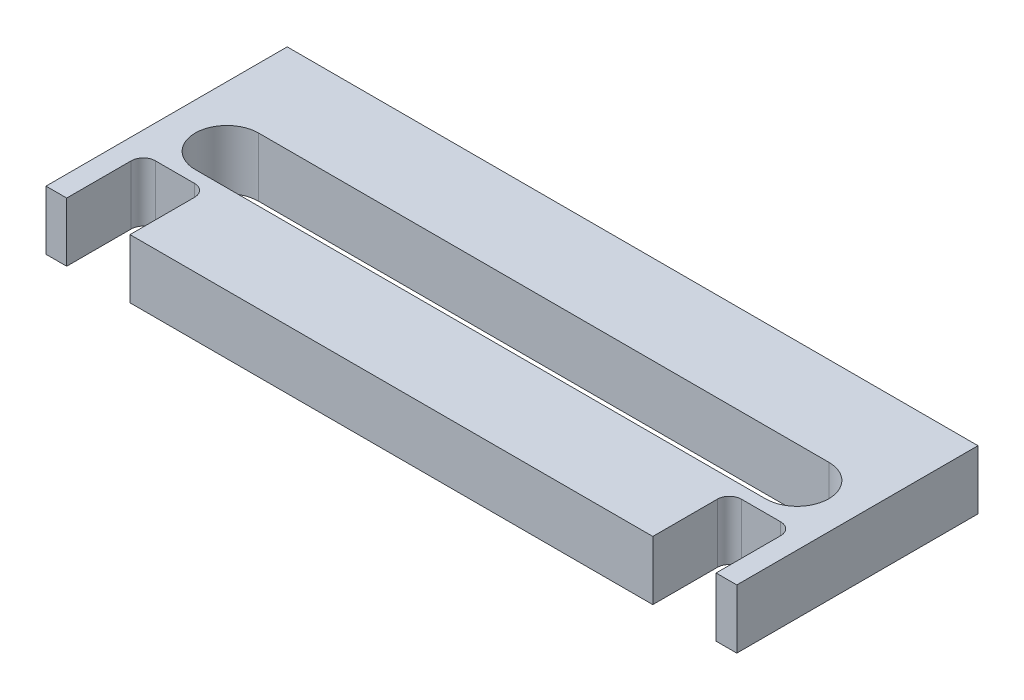
ISO-10303-21;
HEADER;
FILE_DESCRIPTION(('STEP AP214'),'2;1');
FILE_NAME('part.step','',(''),(''),'','','');
FILE_SCHEMA(('AUTOMOTIVE_DESIGN { 1 0 10303 214 1 1 1 1 }'));
ENDSEC;
DATA;
#1=APPLICATION_CONTEXT('core data for automotive mechanical design processes');
#2=APPLICATION_PROTOCOL_DEFINITION('international standard','automotive_design',2000,#1);
#3=PRODUCT_CONTEXT('',#1,'mechanical');
#4=PRODUCT('Part','Part','',(#3));
#5=PRODUCT_RELATED_PRODUCT_CATEGORY('part','',(#4));
#6=PRODUCT_DEFINITION_FORMATION('','',#4);
#7=PRODUCT_DEFINITION_CONTEXT('part definition',#1,'design');
#8=PRODUCT_DEFINITION('design','',#6,#7);
#9=PRODUCT_DEFINITION_SHAPE('','',#8);
#10=(LENGTH_UNIT() NAMED_UNIT(*) SI_UNIT(.MILLI.,.METRE.));
#11=(NAMED_UNIT(*) PLANE_ANGLE_UNIT() SI_UNIT($,.RADIAN.));
#12=(NAMED_UNIT(*) SI_UNIT($,.STERADIAN.) SOLID_ANGLE_UNIT());
#13=UNCERTAINTY_MEASURE_WITH_UNIT(LENGTH_MEASURE(1.E-05),#10,'distance_accuracy_value','');
#14=(GEOMETRIC_REPRESENTATION_CONTEXT(3) GLOBAL_UNCERTAINTY_ASSIGNED_CONTEXT((#13)) GLOBAL_UNIT_ASSIGNED_CONTEXT((#10,
#11,#12)) REPRESENTATION_CONTEXT('',''));
#15=CARTESIAN_POINT('',(0.,0.,0.));
#16=DIRECTION('',(0.,0.,1.));
#17=DIRECTION('',(1.,0.,0.));
#18=AXIS2_PLACEMENT_3D('',#15,#16,#17);
#19=CARTESIAN_POINT('',(1.625,5.1,-26.5));
#20=DIRECTION('',(0.,1.,0.));
#21=DIRECTION('',(0.,0.,1.));
#22=AXIS2_PLACEMENT_3D('',#19,#20,#21);
#23=CYLINDRICAL_SURFACE('',#22,1.);
#24=CARTESIAN_POINT('',(1.625,10.,-26.5));
#25=DIRECTION('',(0.,-1.,0.));
#26=DIRECTION('',(0.,0.,1.));
#27=AXIS2_PLACEMENT_3D('',#24,#25,#26);
#28=CIRCLE('',#27,1.);
#29=CARTESIAN_POINT('',(1.625,10.,-27.5));
#30=VERTEX_POINT('',#29);
#31=CARTESIAN_POINT('',(2.625,10.,-26.5));
#32=VERTEX_POINT('',#31);
#33=EDGE_CURVE('E271',#30,#32,#28,.T.);
#34=ORIENTED_EDGE('',*,*,#33,.F.);
#35=DIRECTION('',(0.,1.,0.));
#36=VECTOR('',#35,1.);
#37=CARTESIAN_POINT('',(1.625,5.1,-27.5));
#38=LINE('',#37,#36);
#39=CARTESIAN_POINT('',(1.625,5.1,-27.5));
#40=VERTEX_POINT('',#39);
#41=EDGE_CURVE('E12',#40,#30,#38,.T.);
#42=ORIENTED_EDGE('',*,*,#41,.F.);
#43=CARTESIAN_POINT('',(1.625,5.1,-26.5));
#44=DIRECTION('',(0.,-1.,0.));
#45=DIRECTION('',(0.,0.,1.));
#46=AXIS2_PLACEMENT_3D('',#43,#44,#45);
#47=CIRCLE('',#46,1.);
#48=CARTESIAN_POINT('',(2.625,5.1,-26.5));
#49=VERTEX_POINT('',#48);
#50=EDGE_CURVE('E304',#40,#49,#47,.T.);
#51=ORIENTED_EDGE('',*,*,#50,.T.);
#52=DIRECTION('',(0.,1.,0.));
#53=VECTOR('',#52,1.);
#54=CARTESIAN_POINT('',(2.625,5.1,-26.5));
#55=LINE('',#54,#53);
#56=EDGE_CURVE('E160',#49,#32,#55,.T.);
#57=ORIENTED_EDGE('',*,*,#56,.T.);
#58=EDGE_LOOP('',(#34,#42,#51,#57));
#59=FACE_BOUND('',#58,.T.);
#60=ADVANCED_FACE('F157',(#59),#23,.F.);
#61=CARTESIAN_POINT('',(-1.625,5.1,-27.5));
#62=DIRECTION('',(0.,0.,1.));
#63=DIRECTION('',(1.,0.,0.));
#64=AXIS2_PLACEMENT_3D('',#61,#62,#63);
#65=PLANE('',#64);
#66=DIRECTION('',(1.,0.,0.));
#67=VECTOR('',#66,1.);
#68=CARTESIAN_POINT('',(-1.625,10.,-27.5));
#69=LINE('',#68,#67);
#70=CARTESIAN_POINT('',(-1.625,10.,-27.5));
#71=VERTEX_POINT('',#70);
#72=EDGE_CURVE('E302',#71,#30,#69,.T.);
#73=ORIENTED_EDGE('',*,*,#72,.F.);
#74=DIRECTION('',(0.,1.,0.));
#75=VECTOR('',#74,1.);
#76=CARTESIAN_POINT('',(-1.625,5.1,-27.5));
#77=LINE('',#76,#75);
#78=CARTESIAN_POINT('',(-1.625,5.1,-27.5));
#79=VERTEX_POINT('',#78);
#80=EDGE_CURVE('E166',#79,#71,#77,.T.);
#81=ORIENTED_EDGE('',*,*,#80,.F.);
#82=DIRECTION('',(1.,0.,0.));
#83=VECTOR('',#82,1.);
#84=CARTESIAN_POINT('',(-1.625,5.1,-27.5));
#85=LINE('',#84,#83);
#86=EDGE_CURVE('E261',#79,#40,#85,.T.);
#87=ORIENTED_EDGE('',*,*,#86,.T.);
#88=ORIENTED_EDGE('',*,*,#41,.T.);
#89=EDGE_LOOP('',(#73,#81,#87,#88));
#90=FACE_BOUND('',#89,.T.);
#91=ADVANCED_FACE('F322',(#90),#65,.T.);
#92=CARTESIAN_POINT('',(-1.625,5.1,-26.5));
#93=DIRECTION('',(0.,1.,0.));
#94=DIRECTION('',(0.,0.,1.));
#95=AXIS2_PLACEMENT_3D('',#92,#93,#94);
#96=CYLINDRICAL_SURFACE('',#95,1.);
#97=CARTESIAN_POINT('',(-1.625,10.,-26.5));
#98=DIRECTION('',(0.,-1.,0.));
#99=DIRECTION('',(0.,0.,1.));
#100=AXIS2_PLACEMENT_3D('',#97,#98,#99);
#101=CIRCLE('',#100,1.);
#102=CARTESIAN_POINT('',(-2.625,10.,-26.5));
#103=VERTEX_POINT('',#102);
#104=EDGE_CURVE('E246',#103,#71,#101,.T.);
#105=ORIENTED_EDGE('',*,*,#104,.F.);
#106=DIRECTION('',(0.,1.,0.));
#107=VECTOR('',#106,1.);
#108=CARTESIAN_POINT('',(-2.625,5.1,-26.5));
#109=LINE('',#108,#107);
#110=CARTESIAN_POINT('',(-2.625,5.1,-26.5));
#111=VERTEX_POINT('',#110);
#112=EDGE_CURVE('E241',#111,#103,#109,.T.);
#113=ORIENTED_EDGE('',*,*,#112,.F.);
#114=CARTESIAN_POINT('',(-1.625,5.1,-26.5));
#115=DIRECTION('',(0.,-1.,0.));
#116=DIRECTION('',(0.,0.,1.));
#117=AXIS2_PLACEMENT_3D('',#114,#115,#116);
#118=CIRCLE('',#117,1.);
#119=EDGE_CURVE('E244',#111,#79,#118,.T.);
#120=ORIENTED_EDGE('',*,*,#119,.T.);
#121=ORIENTED_EDGE('',*,*,#80,.T.);
#122=EDGE_LOOP('',(#105,#113,#120,#121));
#123=FACE_BOUND('',#122,.T.);
#124=ADVANCED_FACE('F243',(#123),#96,.F.);
#125=CARTESIAN_POINT('',(-2.625,5.1,-26.5));
#126=DIRECTION('',(1.,0.,0.));
#127=DIRECTION('',(0.,0.,-1.));
#128=AXIS2_PLACEMENT_3D('',#125,#126,#127);
#129=PLANE('',#128);
#130=DIRECTION('',(0.,0.,-1.));
#131=VECTOR('',#130,1.);
#132=CARTESIAN_POINT('',(-2.625,10.,-26.5));
#133=LINE('',#132,#131);
#134=CARTESIAN_POINT('',(-2.625,10.,-21.1480648995476));
#135=VERTEX_POINT('',#134);
#136=EDGE_CURVE('E299',#135,#103,#133,.T.);
#137=ORIENTED_EDGE('',*,*,#136,.F.);
#138=DIRECTION('',(0.,1.,0.));
#139=VECTOR('',#138,1.);
#140=CARTESIAN_POINT('',(-2.625,5.1,-21.1480648995476));
#141=LINE('',#140,#139);
#142=CARTESIAN_POINT('',(-2.625,5.1,-21.1480648995476));
#143=VERTEX_POINT('',#142);
#144=EDGE_CURVE('E251',#143,#135,#141,.T.);
#145=ORIENTED_EDGE('',*,*,#144,.F.);
#146=DIRECTION('',(0.,0.,-1.));
#147=VECTOR('',#146,1.);
#148=CARTESIAN_POINT('',(-2.625,5.1,-26.5));
#149=LINE('',#148,#147);
#150=EDGE_CURVE('E259',#143,#111,#149,.T.);
#151=ORIENTED_EDGE('',*,*,#150,.T.);
#152=ORIENTED_EDGE('',*,*,#112,.T.);
#153=EDGE_LOOP('',(#137,#145,#151,#152));
#154=FACE_BOUND('',#153,.T.);
#155=ADVANCED_FACE('F263',(#154),#129,.T.);
#156=CARTESIAN_POINT('',(-2.625,5.1,-21.1480648995476));
#157=DIRECTION('',(0.,0.,1.));
#158=DIRECTION('',(1.,0.,0.));
#159=AXIS2_PLACEMENT_3D('',#156,#157,#158);
#160=PLANE('',#159);
#161=DIRECTION('',(1.,0.,0.));
#162=VECTOR('',#161,1.);
#163=CARTESIAN_POINT('',(-2.625,10.,-21.1480648995476));
#164=LINE('',#163,#162);
#165=CARTESIAN_POINT('',(-4.34053483004038,10.,-21.1480648995476));
#166=VERTEX_POINT('',#165);
#167=EDGE_CURVE('E296',#166,#135,#164,.T.);
#168=ORIENTED_EDGE('',*,*,#167,.F.);
#169=DIRECTION('',(0.,1.,0.));
#170=VECTOR('',#169,1.);
#171=CARTESIAN_POINT('',(-4.34053483004038,5.1,-21.1480648995476));
#172=LINE('',#171,#170);
#173=CARTESIAN_POINT('',(-4.34053483004038,5.1,-21.1480648995476));
#174=VERTEX_POINT('',#173);
#175=EDGE_CURVE('E308',#174,#166,#172,.T.);
#176=ORIENTED_EDGE('',*,*,#175,.F.);
#177=DIRECTION('',(1.,0.,0.));
#178=VECTOR('',#177,1.);
#179=CARTESIAN_POINT('',(-2.625,5.1,-21.1480648995476));
#180=LINE('',#179,#178);
#181=EDGE_CURVE('E264',#174,#143,#180,.T.);
#182=ORIENTED_EDGE('',*,*,#181,.T.);
#183=ORIENTED_EDGE('',*,*,#144,.T.);
#184=EDGE_LOOP('',(#168,#176,#182,#183));
#185=FACE_BOUND('',#184,.T.);
#186=ADVANCED_FACE('F335',(#185),#160,.T.);
#187=CARTESIAN_POINT('',(-4.34053483004038,5.1,-21.1480648995476));
#188=DIRECTION('',(-1.,0.,0.));
#189=DIRECTION('',(0.,0.,1.));
#190=AXIS2_PLACEMENT_3D('',#187,#188,#189);
#191=PLANE('',#190);
#192=DIRECTION('',(0.,0.,1.));
#193=VECTOR('',#192,1.);
#194=CARTESIAN_POINT('',(-4.34053483004038,10.,-21.1480648995476));
#195=LINE('',#194,#193);
#196=CARTESIAN_POINT('',(-4.34053483004038,10.,-41.1480648995476));
#197=VERTEX_POINT('',#196);
#198=EDGE_CURVE('E293',#197,#166,#195,.T.);
#199=ORIENTED_EDGE('',*,*,#198,.F.);
#200=DIRECTION('',(0.,1.,0.));
#201=VECTOR('',#200,1.);
#202=CARTESIAN_POINT('',(-4.34053483004038,5.1,-41.1480648995476));
#203=LINE('',#202,#201);
#204=CARTESIAN_POINT('',(-4.34053483004038,5.1,-41.1480648995476));
#205=VERTEX_POINT('',#204);
#206=EDGE_CURVE('E310',#205,#197,#203,.T.);
#207=ORIENTED_EDGE('',*,*,#206,.F.);
#208=DIRECTION('',(0.,0.,1.));
#209=VECTOR('',#208,1.);
#210=CARTESIAN_POINT('',(-4.34053483004038,5.1,-21.1480648995476));
#211=LINE('',#210,#209);
#212=EDGE_CURVE('E266',#205,#174,#211,.T.);
#213=ORIENTED_EDGE('',*,*,#212,.T.);
#214=ORIENTED_EDGE('',*,*,#175,.T.);
#215=EDGE_LOOP('',(#199,#207,#213,#214));
#216=FACE_BOUND('',#215,.T.);
#217=ADVANCED_FACE('F338',(#216),#191,.T.);
#218=CARTESIAN_POINT('',(-4.34053483004038,5.1,-41.1480648995476));
#219=DIRECTION('',(0.,0.,-1.));
#220=DIRECTION('',(-1.,0.,0.));
#221=AXIS2_PLACEMENT_3D('',#218,#219,#220);
#222=PLANE('',#221);
#223=DIRECTION('',(-1.,0.,0.));
#224=VECTOR('',#223,1.);
#225=CARTESIAN_POINT('',(-4.34053483004038,10.,-41.1480648995476));
#226=LINE('',#225,#224);
#227=CARTESIAN_POINT('',(52.9405348300404,10.,-41.1480648995476));
#228=VERTEX_POINT('',#227);
#229=EDGE_CURVE('E290',#228,#197,#226,.T.);
#230=ORIENTED_EDGE('',*,*,#229,.F.);
#231=DIRECTION('',(0.,1.,0.));
#232=VECTOR('',#231,1.);
#233=CARTESIAN_POINT('',(52.9405348300404,5.1,-41.1480648995476));
#234=LINE('',#233,#232);
#235=CARTESIAN_POINT('',(52.9405348300404,5.1,-41.1480648995476));
#236=VERTEX_POINT('',#235);
#237=EDGE_CURVE('E466',#236,#228,#234,.T.);
#238=ORIENTED_EDGE('',*,*,#237,.F.);
#239=DIRECTION('',(-1.,0.,0.));
#240=VECTOR('',#239,1.);
#241=CARTESIAN_POINT('',(-4.34053483004038,5.1,-41.1480648995476));
#242=LINE('',#241,#240);
#243=EDGE_CURVE('E507',#236,#205,#242,.T.);
#244=ORIENTED_EDGE('',*,*,#243,.T.);
#245=ORIENTED_EDGE('',*,*,#206,.T.);
#246=EDGE_LOOP('',(#230,#238,#244,#245));
#247=FACE_BOUND('',#246,.T.);
#248=ADVANCED_FACE('F342',(#247),#222,.T.);
#249=CARTESIAN_POINT('',(0.659465169959616,5.1,-33.7730648995476));
#250=DIRECTION('',(0.,0.,1.));
#251=DIRECTION('',(1.,0.,0.));
#252=AXIS2_PLACEMENT_3D('',#249,#250,#251);
#253=PLANE('',#252);
#254=DIRECTION('',(1.,0.,0.));
#255=VECTOR('',#254,1.);
#256=CARTESIAN_POINT('',(0.659465169959616,10.,-33.7730648995476));
#257=LINE('',#256,#255);
#258=CARTESIAN_POINT('',(0.659465169959616,10.,-33.7730648995476));
#259=VERTEX_POINT('',#258);
#260=CARTESIAN_POINT('',(47.9405348300404,10.,-33.7730648995476));
#261=VERTEX_POINT('',#260);
#262=EDGE_CURVE('E287',#259,#261,#257,.T.);
#263=ORIENTED_EDGE('',*,*,#262,.F.);
#264=DIRECTION('',(0.,1.,0.));
#265=VECTOR('',#264,1.);
#266=CARTESIAN_POINT('',(0.659465169959616,5.1,-33.7730648995476));
#267=LINE('',#266,#265);
#268=CARTESIAN_POINT('',(0.659465169959616,5.1,-33.7730648995476));
#269=VERTEX_POINT('',#268);
#270=EDGE_CURVE('E312',#269,#259,#267,.T.);
#271=ORIENTED_EDGE('',*,*,#270,.F.);
#272=DIRECTION('',(1.,0.,0.));
#273=VECTOR('',#272,1.);
#274=CARTESIAN_POINT('',(0.659465169959616,5.1,-33.7730648995476));
#275=LINE('',#274,#273);
#276=CARTESIAN_POINT('',(47.9405348300404,5.1,-33.7730648995476));
#277=VERTEX_POINT('',#276);
#278=EDGE_CURVE('E504',#269,#277,#275,.T.);
#279=ORIENTED_EDGE('',*,*,#278,.T.);
#280=DIRECTION('',(0.,1.,0.));
#281=VECTOR('',#280,1.);
#282=CARTESIAN_POINT('',(47.9405348300404,5.1,-33.7730648995476));
#283=LINE('',#282,#281);
#284=EDGE_CURVE('E472',#277,#261,#283,.T.);
#285=ORIENTED_EDGE('',*,*,#284,.T.);
#286=EDGE_LOOP('',(#263,#271,#279,#285));
#287=FACE_BOUND('',#286,.T.);
#288=ADVANCED_FACE('F346',(#287),#253,.T.);
#289=CARTESIAN_POINT('',(0.659465169959616,5.1,-31.1480648995476));
#290=DIRECTION('',(0.,1.,0.));
#291=DIRECTION('',(0.,0.,1.));
#292=AXIS2_PLACEMENT_3D('',#289,#290,#291);
#293=CYLINDRICAL_SURFACE('',#292,2.625);
#294=CARTESIAN_POINT('',(0.659465169959616,10.,-31.1480648995476));
#295=DIRECTION('',(0.,-1.,0.));
#296=DIRECTION('',(0.,0.,1.));
#297=AXIS2_PLACEMENT_3D('',#294,#295,#296);
#298=CIRCLE('',#297,2.625);
#299=CARTESIAN_POINT('',(0.659465169959616,10.,-28.5230648995476));
#300=VERTEX_POINT('',#299);
#301=EDGE_CURVE('E284',#300,#259,#298,.T.);
#302=ORIENTED_EDGE('',*,*,#301,.F.);
#303=DIRECTION('',(0.,1.,0.));
#304=VECTOR('',#303,1.);
#305=CARTESIAN_POINT('',(0.659465169959616,5.1,-28.5230648995476));
#306=LINE('',#305,#304);
#307=CARTESIAN_POINT('',(0.659465169959616,5.1,-28.5230648995476));
#308=VERTEX_POINT('',#307);
#309=EDGE_CURVE('E314',#308,#300,#306,.T.);
#310=ORIENTED_EDGE('',*,*,#309,.F.);
#311=CARTESIAN_POINT('',(0.659465169959616,5.1,-31.1480648995476));
#312=DIRECTION('',(0.,-1.,0.));
#313=DIRECTION('',(0.,0.,1.));
#314=AXIS2_PLACEMENT_3D('',#311,#312,#313);
#315=CIRCLE('',#314,2.625);
#316=EDGE_CURVE('E501',#308,#269,#315,.T.);
#317=ORIENTED_EDGE('',*,*,#316,.T.);
#318=ORIENTED_EDGE('',*,*,#270,.T.);
#319=EDGE_LOOP('',(#302,#310,#317,#318));
#320=FACE_BOUND('',#319,.T.);
#321=ADVANCED_FACE('F350',(#320),#293,.F.);
#322=CARTESIAN_POINT('',(0.659465169959616,5.1,-28.5230648995476));
#323=DIRECTION('',(0.,0.,-1.));
#324=DIRECTION('',(-1.,0.,0.));
#325=AXIS2_PLACEMENT_3D('',#322,#323,#324);
#326=PLANE('',#325);
#327=DIRECTION('',(-1.,0.,0.));
#328=VECTOR('',#327,1.);
#329=CARTESIAN_POINT('',(0.659465169959616,10.,-28.5230648995476));
#330=LINE('',#329,#328);
#331=CARTESIAN_POINT('',(47.9405348300404,10.,-28.5230648995476));
#332=VERTEX_POINT('',#331);
#333=EDGE_CURVE('E281',#332,#300,#330,.T.);
#334=ORIENTED_EDGE('',*,*,#333,.F.);
#335=DIRECTION('',(0.,1.,0.));
#336=VECTOR('',#335,1.);
#337=CARTESIAN_POINT('',(47.9405348300404,5.1,-28.5230648995476));
#338=LINE('',#337,#336);
#339=CARTESIAN_POINT('',(47.9405348300404,5.1,-28.5230648995476));
#340=VERTEX_POINT('',#339);
#341=EDGE_CURVE('E478',#340,#332,#338,.T.);
#342=ORIENTED_EDGE('',*,*,#341,.F.);
#343=DIRECTION('',(-1.,0.,0.));
#344=VECTOR('',#343,1.);
#345=CARTESIAN_POINT('',(0.659465169959616,5.1,-28.5230648995476));
#346=LINE('',#345,#344);
#347=EDGE_CURVE('E498',#340,#308,#346,.T.);
#348=ORIENTED_EDGE('',*,*,#347,.T.);
#349=ORIENTED_EDGE('',*,*,#309,.T.);
#350=EDGE_LOOP('',(#334,#342,#348,#349));
#351=FACE_BOUND('',#350,.T.);
#352=ADVANCED_FACE('F354',(#351),#326,.T.);
#353=CARTESIAN_POINT('',(24.3,5.1,-21.1480648995476));
#354=DIRECTION('',(0.,0.,1.));
#355=DIRECTION('',(1.,0.,0.));
#356=AXIS2_PLACEMENT_3D('',#353,#354,#355);
#357=PLANE('',#356);
#358=DIRECTION('',(1.,0.,0.));
#359=VECTOR('',#358,1.);
#360=CARTESIAN_POINT('',(24.3,10.,-21.1480648995476));
#361=LINE('',#360,#359);
#362=CARTESIAN_POINT('',(2.625,10.,-21.1480648995476));
#363=VERTEX_POINT('',#362);
#364=CARTESIAN_POINT('',(45.975,10.,-21.1480648995476));
#365=VERTEX_POINT('',#364);
#366=EDGE_CURVE('E278',#363,#365,#361,.T.);
#367=ORIENTED_EDGE('',*,*,#366,.F.);
#368=DIRECTION('',(0.,1.,0.));
#369=VECTOR('',#368,1.);
#370=CARTESIAN_POINT('',(2.625,5.1,-21.1480648995476));
#371=LINE('',#370,#369);
#372=CARTESIAN_POINT('',(2.625,5.1,-21.1480648995476));
#373=VERTEX_POINT('',#372);
#374=EDGE_CURVE('E315',#373,#363,#371,.T.);
#375=ORIENTED_EDGE('',*,*,#374,.F.);
#376=DIRECTION('',(1.,0.,0.));
#377=VECTOR('',#376,1.);
#378=CARTESIAN_POINT('',(24.3,5.1,-21.1480648995476));
#379=LINE('',#378,#377);
#380=CARTESIAN_POINT('',(45.975,5.1,-21.1480648995476));
#381=VERTEX_POINT('',#380);
#382=EDGE_CURVE('E495',#373,#381,#379,.T.);
#383=ORIENTED_EDGE('',*,*,#382,.T.);
#384=DIRECTION('',(0.,1.,0.));
#385=VECTOR('',#384,1.);
#386=CARTESIAN_POINT('',(45.975,5.1,-21.1480648995476));
#387=LINE('',#386,#385);
#388=EDGE_CURVE('E484',#381,#365,#387,.T.);
#389=ORIENTED_EDGE('',*,*,#388,.T.);
#390=EDGE_LOOP('',(#367,#375,#383,#389));
#391=FACE_BOUND('',#390,.T.);
#392=ADVANCED_FACE('F358',(#391),#357,.T.);
#393=CARTESIAN_POINT('',(2.625,5.1,-21.1480648995476));
#394=DIRECTION('',(-1.,0.,0.));
#395=DIRECTION('',(0.,0.,1.));
#396=AXIS2_PLACEMENT_3D('',#393,#394,#395);
#397=PLANE('',#396);
#398=DIRECTION('',(0.,0.,1.));
#399=VECTOR('',#398,1.);
#400=CARTESIAN_POINT('',(2.625,10.,-21.1480648995476));
#401=LINE('',#400,#399);
#402=EDGE_CURVE('E274',#32,#363,#401,.T.);
#403=ORIENTED_EDGE('',*,*,#402,.F.);
#404=ORIENTED_EDGE('',*,*,#56,.F.);
#405=DIRECTION('',(0.,0.,1.));
#406=VECTOR('',#405,1.);
#407=CARTESIAN_POINT('',(2.625,5.1,-21.1480648995476));
#408=LINE('',#407,#406);
#409=EDGE_CURVE('E493',#49,#373,#408,.T.);
#410=ORIENTED_EDGE('',*,*,#409,.T.);
#411=ORIENTED_EDGE('',*,*,#374,.T.);
#412=EDGE_LOOP('',(#403,#404,#410,#411));
#413=FACE_BOUND('',#412,.T.);
#414=ADVANCED_FACE('F317',(#413),#397,.T.);
#415=CARTESIAN_POINT('',(1.625,5.1,-26.5));
#416=DIRECTION('',(0.,1.,0.));
#417=DIRECTION('',(0.,0.,1.));
#418=AXIS2_PLACEMENT_3D('',#415,#416,#417);
#419=PLANE('',#418);
#420=ORIENTED_EDGE('',*,*,#243,.F.);
#421=DIRECTION('',(0.,0.,1.));
#422=VECTOR('',#421,1.);
#423=CARTESIAN_POINT('',(52.9405348300404,5.1,-21.1480648995476));
#424=LINE('',#423,#422);
#425=CARTESIAN_POINT('',(52.9405348300404,5.1,-21.1480648995476));
#426=VERTEX_POINT('',#425);
#427=EDGE_CURVE('E469',#236,#426,#424,.T.);
#428=ORIENTED_EDGE('',*,*,#427,.T.);
#429=DIRECTION('',(-1.,0.,0.));
#430=VECTOR('',#429,1.);
#431=CARTESIAN_POINT('',(51.225,5.1,-21.1480648995476));
#432=LINE('',#431,#430);
#433=CARTESIAN_POINT('',(51.225,5.1,-21.1480648995476));
#434=VERTEX_POINT('',#433);
#435=EDGE_CURVE('E460',#426,#434,#432,.T.);
#436=ORIENTED_EDGE('',*,*,#435,.T.);
#437=DIRECTION('',(0.,0.,-1.));
#438=VECTOR('',#437,1.);
#439=CARTESIAN_POINT('',(51.225,5.1,-26.5));
#440=LINE('',#439,#438);
#441=CARTESIAN_POINT('',(51.225,5.1,-26.5));
#442=VERTEX_POINT('',#441);
#443=EDGE_CURVE('E451',#434,#442,#440,.T.);
#444=ORIENTED_EDGE('',*,*,#443,.T.);
#445=CARTESIAN_POINT('',(50.225,5.1,-26.5));
#446=DIRECTION('',(0.,1.,0.));
#447=DIRECTION('',(0.,0.,1.));
#448=AXIS2_PLACEMENT_3D('',#445,#446,#447);
#449=CIRCLE('',#448,1.);
#450=CARTESIAN_POINT('',(50.225,5.1,-27.5));
#451=VERTEX_POINT('',#450);
#452=EDGE_CURVE('E442',#442,#451,#449,.T.);
#453=ORIENTED_EDGE('',*,*,#452,.T.);
#454=DIRECTION('',(-1.,0.,0.));
#455=VECTOR('',#454,1.);
#456=CARTESIAN_POINT('',(50.225,5.1,-27.5));
#457=LINE('',#456,#455);
#458=CARTESIAN_POINT('',(46.975,5.1,-27.5));
#459=VERTEX_POINT('',#458);
#460=EDGE_CURVE('E433',#451,#459,#457,.T.);
#461=ORIENTED_EDGE('',*,*,#460,.T.);
#462=CARTESIAN_POINT('',(46.975,5.1,-26.5));
#463=DIRECTION('',(0.,1.,0.));
#464=DIRECTION('',(0.,0.,1.));
#465=AXIS2_PLACEMENT_3D('',#462,#463,#464);
#466=CIRCLE('',#465,1.);
#467=CARTESIAN_POINT('',(45.975,5.1,-26.5));
#468=VERTEX_POINT('',#467);
#469=EDGE_CURVE('E421',#459,#468,#466,.T.);
#470=ORIENTED_EDGE('',*,*,#469,.T.);
#471=DIRECTION('',(0.,0.,1.));
#472=VECTOR('',#471,1.);
#473=CARTESIAN_POINT('',(45.975,5.1,-21.1480648995476));
#474=LINE('',#473,#472);
#475=EDGE_CURVE('E275',#468,#381,#474,.T.);
#476=ORIENTED_EDGE('',*,*,#475,.T.);
#477=ORIENTED_EDGE('',*,*,#382,.F.);
#478=ORIENTED_EDGE('',*,*,#409,.F.);
#479=ORIENTED_EDGE('',*,*,#50,.F.);
#480=ORIENTED_EDGE('',*,*,#86,.F.);
#481=ORIENTED_EDGE('',*,*,#119,.F.);
#482=ORIENTED_EDGE('',*,*,#150,.F.);
#483=ORIENTED_EDGE('',*,*,#181,.F.);
#484=ORIENTED_EDGE('',*,*,#212,.F.);
#485=EDGE_LOOP('',(#420,#428,#436,#444,#453,#461,#470,#476,#477,#478,#479,#480,#481,#482,#483,#484));
#486=FACE_BOUND('',#485,.T.);
#487=CARTESIAN_POINT('',(47.9405348300404,5.1,-31.1480648995476));
#488=DIRECTION('',(0.,1.,0.));
#489=DIRECTION('',(0.,0.,1.));
#490=AXIS2_PLACEMENT_3D('',#487,#488,#489);
#491=CIRCLE('',#490,2.625);
#492=EDGE_CURVE('E481',#340,#277,#491,.T.);
#493=ORIENTED_EDGE('',*,*,#492,.T.);
#494=ORIENTED_EDGE('',*,*,#278,.F.);
#495=ORIENTED_EDGE('',*,*,#316,.F.);
#496=ORIENTED_EDGE('',*,*,#347,.F.);
#497=EDGE_LOOP('',(#493,#494,#495,#496));
#498=FACE_BOUND('',#497,.T.);
#499=ADVANCED_FACE('F256',(#486,#498),#419,.F.);
#500=CARTESIAN_POINT('',(1.625,10.,-26.5));
#501=DIRECTION('',(0.,1.,0.));
#502=DIRECTION('',(0.,0.,1.));
#503=AXIS2_PLACEMENT_3D('',#500,#501,#502);
#504=PLANE('',#503);
#505=DIRECTION('',(0.,0.,1.));
#506=VECTOR('',#505,1.);
#507=CARTESIAN_POINT('',(52.9405348300404,10.,-21.1480648995476));
#508=LINE('',#507,#506);
#509=CARTESIAN_POINT('',(52.9405348300404,10.,-21.1480648995476));
#510=VERTEX_POINT('',#509);
#511=EDGE_CURVE('E463',#228,#510,#508,.T.);
#512=ORIENTED_EDGE('',*,*,#511,.F.);
#513=ORIENTED_EDGE('',*,*,#229,.T.);
#514=ORIENTED_EDGE('',*,*,#198,.T.);
#515=ORIENTED_EDGE('',*,*,#167,.T.);
#516=ORIENTED_EDGE('',*,*,#136,.T.);
#517=ORIENTED_EDGE('',*,*,#104,.T.);
#518=ORIENTED_EDGE('',*,*,#72,.T.);
#519=ORIENTED_EDGE('',*,*,#33,.T.);
#520=ORIENTED_EDGE('',*,*,#402,.T.);
#521=ORIENTED_EDGE('',*,*,#366,.T.);
#522=DIRECTION('',(0.,0.,1.));
#523=VECTOR('',#522,1.);
#524=CARTESIAN_POINT('',(45.975,10.,-21.1480648995476));
#525=LINE('',#524,#523);
#526=CARTESIAN_POINT('',(45.975,10.,-26.5));
#527=VERTEX_POINT('',#526);
#528=EDGE_CURVE('E487',#527,#365,#525,.T.);
#529=ORIENTED_EDGE('',*,*,#528,.F.);
#530=CARTESIAN_POINT('',(46.975,10.,-26.5));
#531=DIRECTION('',(0.,1.,0.));
#532=DIRECTION('',(0.,0.,1.));
#533=AXIS2_PLACEMENT_3D('',#530,#531,#532);
#534=CIRCLE('',#533,1.);
#535=CARTESIAN_POINT('',(46.975,10.,-27.5));
#536=VERTEX_POINT('',#535);
#537=EDGE_CURVE('E408',#536,#527,#534,.T.);
#538=ORIENTED_EDGE('',*,*,#537,.F.);
#539=DIRECTION('',(-1.,0.,0.));
#540=VECTOR('',#539,1.);
#541=CARTESIAN_POINT('',(50.225,10.,-27.5));
#542=LINE('',#541,#540);
#543=CARTESIAN_POINT('',(50.225,10.,-27.5));
#544=VERTEX_POINT('',#543);
#545=EDGE_CURVE('E427',#544,#536,#542,.T.);
#546=ORIENTED_EDGE('',*,*,#545,.F.);
#547=CARTESIAN_POINT('',(50.225,10.,-26.5));
#548=DIRECTION('',(0.,1.,0.));
#549=DIRECTION('',(0.,0.,1.));
#550=AXIS2_PLACEMENT_3D('',#547,#548,#549);
#551=CIRCLE('',#550,1.);
#552=CARTESIAN_POINT('',(51.225,10.,-26.5));
#553=VERTEX_POINT('',#552);
#554=EDGE_CURVE('E436',#553,#544,#551,.T.);
#555=ORIENTED_EDGE('',*,*,#554,.F.);
#556=DIRECTION('',(0.,0.,-1.));
#557=VECTOR('',#556,1.);
#558=CARTESIAN_POINT('',(51.225,10.,-26.5));
#559=LINE('',#558,#557);
#560=CARTESIAN_POINT('',(51.225,10.,-21.1480648995476));
#561=VERTEX_POINT('',#560);
#562=EDGE_CURVE('E445',#561,#553,#559,.T.);
#563=ORIENTED_EDGE('',*,*,#562,.F.);
#564=DIRECTION('',(-1.,0.,0.));
#565=VECTOR('',#564,1.);
#566=CARTESIAN_POINT('',(51.225,10.,-21.1480648995476));
#567=LINE('',#566,#565);
#568=EDGE_CURVE('E454',#510,#561,#567,.T.);
#569=ORIENTED_EDGE('',*,*,#568,.F.);
#570=EDGE_LOOP('',(#512,#513,#514,#515,#516,#517,#518,#519,#520,#521,#529,#538,#546,#555,#563,#569));
#571=FACE_BOUND('',#570,.T.);
#572=ORIENTED_EDGE('',*,*,#262,.T.);
#573=CARTESIAN_POINT('',(47.9405348300404,10.,-31.1480648995476));
#574=DIRECTION('',(0.,1.,0.));
#575=DIRECTION('',(0.,0.,1.));
#576=AXIS2_PLACEMENT_3D('',#573,#574,#575);
#577=CIRCLE('',#576,2.625);
#578=EDGE_CURVE('E475',#332,#261,#577,.T.);
#579=ORIENTED_EDGE('',*,*,#578,.F.);
#580=ORIENTED_EDGE('',*,*,#333,.T.);
#581=ORIENTED_EDGE('',*,*,#301,.T.);
#582=EDGE_LOOP('',(#572,#579,#580,#581));
#583=FACE_BOUND('',#582,.T.);
#584=ADVANCED_FACE('F320',(#571,#583),#504,.T.);
#585=CARTESIAN_POINT('',(46.975,5.1,-26.5));
#586=DIRECTION('',(0.,1.,0.));
#587=DIRECTION('',(0.,0.,1.));
#588=AXIS2_PLACEMENT_3D('',#585,#586,#587);
#589=CYLINDRICAL_SURFACE('',#588,1.);
#590=ORIENTED_EDGE('',*,*,#537,.T.);
#591=DIRECTION('',(0.,1.,0.));
#592=VECTOR('',#591,1.);
#593=CARTESIAN_POINT('',(45.975,5.1,-26.5));
#594=LINE('',#593,#592);
#595=EDGE_CURVE('E412',#468,#527,#594,.T.);
#596=ORIENTED_EDGE('',*,*,#595,.F.);
#597=ORIENTED_EDGE('',*,*,#469,.F.);
#598=DIRECTION('',(0.,1.,0.));
#599=VECTOR('',#598,1.);
#600=CARTESIAN_POINT('',(46.975,5.1,-27.5));
#601=LINE('',#600,#599);
#602=EDGE_CURVE('E415',#459,#536,#601,.T.);
#603=ORIENTED_EDGE('',*,*,#602,.T.);
#604=EDGE_LOOP('',(#590,#596,#597,#603));
#605=FACE_BOUND('',#604,.T.);
#606=ADVANCED_FACE('F369',(#605),#589,.F.);
#607=CARTESIAN_POINT('',(50.225,5.1,-27.5));
#608=DIRECTION('',(0.,0.,1.));
#609=DIRECTION('',(-1.,0.,0.));
#610=AXIS2_PLACEMENT_3D('',#607,#608,#609);
#611=PLANE('',#610);
#612=ORIENTED_EDGE('',*,*,#545,.T.);
#613=ORIENTED_EDGE('',*,*,#602,.F.);
#614=ORIENTED_EDGE('',*,*,#460,.F.);
#615=DIRECTION('',(0.,1.,0.));
#616=VECTOR('',#615,1.);
#617=CARTESIAN_POINT('',(50.225,5.1,-27.5));
#618=LINE('',#617,#616);
#619=EDGE_CURVE('E430',#451,#544,#618,.T.);
#620=ORIENTED_EDGE('',*,*,#619,.T.);
#621=EDGE_LOOP('',(#612,#613,#614,#620));
#622=FACE_BOUND('',#621,.T.);
#623=ADVANCED_FACE('F394',(#622),#611,.T.);
#624=CARTESIAN_POINT('',(50.225,5.1,-26.5));
#625=DIRECTION('',(0.,1.,0.));
#626=DIRECTION('',(0.,0.,1.));
#627=AXIS2_PLACEMENT_3D('',#624,#625,#626);
#628=CYLINDRICAL_SURFACE('',#627,1.);
#629=ORIENTED_EDGE('',*,*,#554,.T.);
#630=ORIENTED_EDGE('',*,*,#619,.F.);
#631=ORIENTED_EDGE('',*,*,#452,.F.);
#632=DIRECTION('',(0.,1.,0.));
#633=VECTOR('',#632,1.);
#634=CARTESIAN_POINT('',(51.225,5.1,-26.5));
#635=LINE('',#634,#633);
#636=EDGE_CURVE('E439',#442,#553,#635,.T.);
#637=ORIENTED_EDGE('',*,*,#636,.T.);
#638=EDGE_LOOP('',(#629,#630,#631,#637));
#639=FACE_BOUND('',#638,.T.);
#640=ADVANCED_FACE('F390',(#639),#628,.F.);
#641=CARTESIAN_POINT('',(51.225,5.1,-26.5));
#642=DIRECTION('',(-1.,0.,0.));
#643=DIRECTION('',(0.,0.,-1.));
#644=AXIS2_PLACEMENT_3D('',#641,#642,#643);
#645=PLANE('',#644);
#646=ORIENTED_EDGE('',*,*,#562,.T.);
#647=ORIENTED_EDGE('',*,*,#636,.F.);
#648=ORIENTED_EDGE('',*,*,#443,.F.);
#649=DIRECTION('',(0.,1.,0.));
#650=VECTOR('',#649,1.);
#651=CARTESIAN_POINT('',(51.225,5.1,-21.1480648995476));
#652=LINE('',#651,#650);
#653=EDGE_CURVE('E448',#434,#561,#652,.T.);
#654=ORIENTED_EDGE('',*,*,#653,.T.);
#655=EDGE_LOOP('',(#646,#647,#648,#654));
#656=FACE_BOUND('',#655,.T.);
#657=ADVANCED_FACE('F386',(#656),#645,.T.);
#658=CARTESIAN_POINT('',(51.225,5.1,-21.1480648995476));
#659=DIRECTION('',(0.,0.,1.));
#660=DIRECTION('',(-1.,0.,0.));
#661=AXIS2_PLACEMENT_3D('',#658,#659,#660);
#662=PLANE('',#661);
#663=ORIENTED_EDGE('',*,*,#568,.T.);
#664=ORIENTED_EDGE('',*,*,#653,.F.);
#665=ORIENTED_EDGE('',*,*,#435,.F.);
#666=DIRECTION('',(0.,1.,0.));
#667=VECTOR('',#666,1.);
#668=CARTESIAN_POINT('',(52.9405348300404,5.1,-21.1480648995476));
#669=LINE('',#668,#667);
#670=EDGE_CURVE('E457',#426,#510,#669,.T.);
#671=ORIENTED_EDGE('',*,*,#670,.T.);
#672=EDGE_LOOP('',(#663,#664,#665,#671));
#673=FACE_BOUND('',#672,.T.);
#674=ADVANCED_FACE('F382',(#673),#662,.T.);
#675=CARTESIAN_POINT('',(52.9405348300404,5.1,-21.1480648995476));
#676=DIRECTION('',(1.,0.,0.));
#677=DIRECTION('',(0.,0.,1.));
#678=AXIS2_PLACEMENT_3D('',#675,#676,#677);
#679=PLANE('',#678);
#680=ORIENTED_EDGE('',*,*,#511,.T.);
#681=ORIENTED_EDGE('',*,*,#670,.F.);
#682=ORIENTED_EDGE('',*,*,#427,.F.);
#683=ORIENTED_EDGE('',*,*,#237,.T.);
#684=EDGE_LOOP('',(#680,#681,#682,#683));
#685=FACE_BOUND('',#684,.T.);
#686=ADVANCED_FACE('F378',(#685),#679,.T.);
#687=CARTESIAN_POINT('',(47.9405348300404,5.1,-31.1480648995476));
#688=DIRECTION('',(0.,1.,0.));
#689=DIRECTION('',(0.,0.,1.));
#690=AXIS2_PLACEMENT_3D('',#687,#688,#689);
#691=CYLINDRICAL_SURFACE('',#690,2.625);
#692=ORIENTED_EDGE('',*,*,#578,.T.);
#693=ORIENTED_EDGE('',*,*,#284,.F.);
#694=ORIENTED_EDGE('',*,*,#492,.F.);
#695=ORIENTED_EDGE('',*,*,#341,.T.);
#696=EDGE_LOOP('',(#692,#693,#694,#695));
#697=FACE_BOUND('',#696,.T.);
#698=ADVANCED_FACE('F374',(#697),#691,.F.);
#699=CARTESIAN_POINT('',(45.975,5.1,-21.1480648995476));
#700=DIRECTION('',(1.,0.,0.));
#701=DIRECTION('',(0.,0.,1.));
#702=AXIS2_PLACEMENT_3D('',#699,#700,#701);
#703=PLANE('',#702);
#704=ORIENTED_EDGE('',*,*,#528,.T.);
#705=ORIENTED_EDGE('',*,*,#388,.F.);
#706=ORIENTED_EDGE('',*,*,#475,.F.);
#707=ORIENTED_EDGE('',*,*,#595,.T.);
#708=EDGE_LOOP('',(#704,#705,#706,#707));
#709=FACE_BOUND('',#708,.T.);
#710=ADVANCED_FACE('F371',(#709),#703,.T.);
#711=CLOSED_SHELL('',(#60,#91,#124,#155,#186,#217,#248,#288,#321,#352,#392,#414,#499,#584,#606,
#623,#640,#657,#674,#686,#698,#710));
#712=MANIFOLD_SOLID_BREP('B2',#711);
#713=ADVANCED_BREP_SHAPE_REPRESENTATION('',(#18,#712),#14);
#714=SHAPE_DEFINITION_REPRESENTATION(#9,#713);
ENDSEC;
END-ISO-10303-21;
